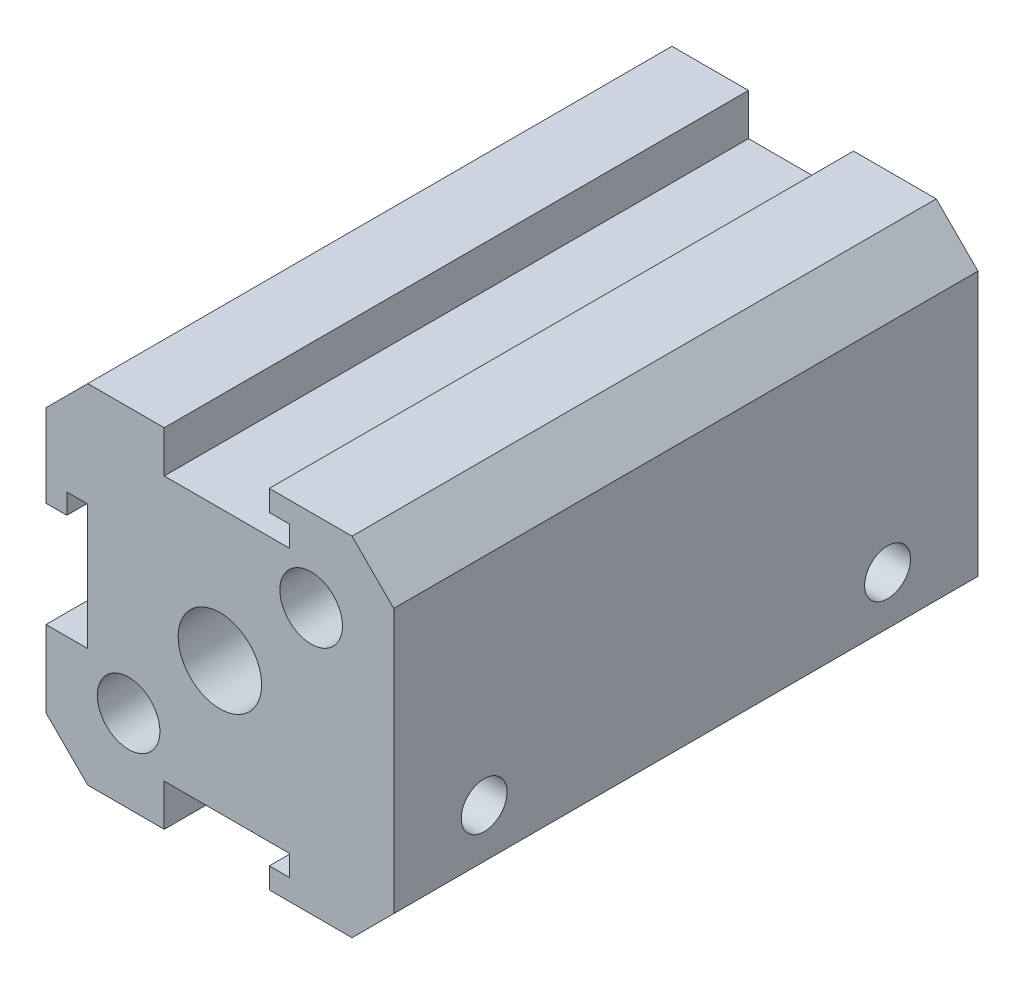
ISO-10303-21;
HEADER;
FILE_DESCRIPTION(('STEP AP214'),'2;1');
FILE_NAME('part.step','',(''),(''),'','','');
FILE_SCHEMA(('AUTOMOTIVE_DESIGN { 1 0 10303 214 1 1 1 1 }'));
ENDSEC;
DATA;
#1=APPLICATION_CONTEXT('core data for automotive mechanical design processes');
#2=APPLICATION_PROTOCOL_DEFINITION('international standard','automotive_design',2000,#1);
#3=PRODUCT_CONTEXT('',#1,'mechanical');
#4=PRODUCT('Part','Part','',(#3));
#5=PRODUCT_RELATED_PRODUCT_CATEGORY('part','',(#4));
#6=PRODUCT_DEFINITION_FORMATION('','',#4);
#7=PRODUCT_DEFINITION_CONTEXT('part definition',#1,'design');
#8=PRODUCT_DEFINITION('design','',#6,#7);
#9=PRODUCT_DEFINITION_SHAPE('','',#8);
#10=(LENGTH_UNIT() NAMED_UNIT(*) SI_UNIT(.MILLI.,.METRE.));
#11=(NAMED_UNIT(*) PLANE_ANGLE_UNIT() SI_UNIT($,.RADIAN.));
#12=(NAMED_UNIT(*) SI_UNIT($,.STERADIAN.) SOLID_ANGLE_UNIT());
#13=UNCERTAINTY_MEASURE_WITH_UNIT(LENGTH_MEASURE(1.E-05),#10,'distance_accuracy_value','');
#14=(GEOMETRIC_REPRESENTATION_CONTEXT(3) GLOBAL_UNCERTAINTY_ASSIGNED_CONTEXT((#13)) GLOBAL_UNIT_ASSIGNED_CONTEXT((#10,
#11,#12)) REPRESENTATION_CONTEXT('',''));
#15=CARTESIAN_POINT('',(0.,0.,0.));
#16=DIRECTION('',(0.,0.,1.));
#17=DIRECTION('',(1.,0.,0.));
#18=AXIS2_PLACEMENT_3D('',#15,#16,#17);
#19=CARTESIAN_POINT('',(0.,0.,42.));
#20=DIRECTION('',(0.,0.,-1.));
#21=DIRECTION('',(-1.,0.,0.));
#22=AXIS2_PLACEMENT_3D('',#19,#20,#21);
#23=PLANE('',#22);
#24=CARTESIAN_POINT('',(6.56066017177982,6.56066017177982,42.));
#25=DIRECTION('',(0.,0.,1.));
#26=DIRECTION('',(1.,0.,0.));
#27=AXIS2_PLACEMENT_3D('',#24,#25,#26);
#28=CIRCLE('',#27,2.24999999999999);
#29=CARTESIAN_POINT('',(8.81066017177981,6.56066017177982,42.));
#30=VERTEX_POINT('',#29);
#31=EDGE_CURVE('E493',#30,#30,#28,.T.);
#32=ORIENTED_EDGE('',*,*,#31,.F.);
#33=EDGE_LOOP('',(#32));
#34=FACE_BOUND('',#33,.T.);
#35=CARTESIAN_POINT('',(-6.56066017177982,-6.56066017177982,42.));
#36=DIRECTION('',(0.,0.,1.));
#37=DIRECTION('',(1.,0.,0.));
#38=AXIS2_PLACEMENT_3D('',#35,#36,#37);
#39=CIRCLE('',#38,2.24999999999999);
#40=CARTESIAN_POINT('',(-4.31066017177983,-6.56066017177982,42.));
#41=VERTEX_POINT('',#40);
#42=EDGE_CURVE('E499',#41,#41,#39,.T.);
#43=ORIENTED_EDGE('',*,*,#42,.F.);
#44=EDGE_LOOP('',(#43));
#45=FACE_BOUND('',#44,.T.);
#46=DIRECTION('',(0.,-1.,0.));
#47=VECTOR('',#46,1.);
#48=CARTESIAN_POINT('',(-12.5,-9.5,42.));
#49=LINE('',#48,#47);
#50=CARTESIAN_POINT('',(-12.5,-3.99999999999999,42.));
#51=VERTEX_POINT('',#50);
#52=CARTESIAN_POINT('',(-12.5,-9.5,42.));
#53=VERTEX_POINT('',#52);
#54=EDGE_CURVE('E291',#51,#53,#49,.T.);
#55=ORIENTED_EDGE('',*,*,#54,.T.);
#56=DIRECTION('',(0.707106781186547,-0.707106781186548,0.));
#57=VECTOR('',#56,1.);
#58=CARTESIAN_POINT('',(-12.5,-9.5,42.));
#59=LINE('',#58,#57);
#60=CARTESIAN_POINT('',(-9.5,-12.5,42.));
#61=VERTEX_POINT('',#60);
#62=EDGE_CURVE('E147',#53,#61,#59,.T.);
#63=ORIENTED_EDGE('',*,*,#62,.T.);
#64=DIRECTION('',(1.,0.,0.));
#65=VECTOR('',#64,1.);
#66=CARTESIAN_POINT('',(-9.5,-12.5,42.));
#67=LINE('',#66,#65);
#68=CARTESIAN_POINT('',(-4.,-12.5,42.));
#69=VERTEX_POINT('',#68);
#70=EDGE_CURVE('E360',#61,#69,#67,.T.);
#71=ORIENTED_EDGE('',*,*,#70,.T.);
#72=DIRECTION('',(0.,1.,0.));
#73=VECTOR('',#72,1.);
#74=CARTESIAN_POINT('',(-4.,-12.5,42.));
#75=LINE('',#74,#73);
#76=CARTESIAN_POINT('',(-3.99999999999999,-9.50000000000001,42.));
#77=VERTEX_POINT('',#76);
#78=EDGE_CURVE('E379',#69,#77,#75,.T.);
#79=ORIENTED_EDGE('',*,*,#78,.T.);
#80=DIRECTION('',(1.,0.,0.));
#81=VECTOR('',#80,1.);
#82=CARTESIAN_POINT('',(-3.99999999999999,-9.50000000000001,42.));
#83=LINE('',#82,#81);
#84=CARTESIAN_POINT('',(5.,-9.50000000000001,42.));
#85=VERTEX_POINT('',#84);
#86=EDGE_CURVE('E376',#77,#85,#83,.T.);
#87=ORIENTED_EDGE('',*,*,#86,.T.);
#88=DIRECTION('',(0.,-1.,0.));
#89=VECTOR('',#88,1.);
#90=CARTESIAN_POINT('',(5.,-9.50000000000001,42.));
#91=LINE('',#90,#89);
#92=CARTESIAN_POINT('',(5.,-11.,42.));
#93=VERTEX_POINT('',#92);
#94=EDGE_CURVE('E378',#85,#93,#91,.T.);
#95=ORIENTED_EDGE('',*,*,#94,.T.);
#96=DIRECTION('',(-1.,0.,0.));
#97=VECTOR('',#96,1.);
#98=CARTESIAN_POINT('',(5.,-11.,42.));
#99=LINE('',#98,#97);
#100=CARTESIAN_POINT('',(3.55,-11.,42.));
#101=VERTEX_POINT('',#100);
#102=EDGE_CURVE('E381',#93,#101,#99,.T.);
#103=ORIENTED_EDGE('',*,*,#102,.T.);
#104=DIRECTION('',(0.,-1.,0.));
#105=VECTOR('',#104,1.);
#106=CARTESIAN_POINT('',(3.55,-11.,42.));
#107=LINE('',#106,#105);
#108=CARTESIAN_POINT('',(3.55,-12.5,42.));
#109=VERTEX_POINT('',#108);
#110=EDGE_CURVE('E387',#101,#109,#107,.T.);
#111=ORIENTED_EDGE('',*,*,#110,.T.);
#112=DIRECTION('',(1.,0.,0.));
#113=VECTOR('',#112,1.);
#114=CARTESIAN_POINT('',(3.55,-12.5,42.));
#115=LINE('',#114,#113);
#116=CARTESIAN_POINT('',(9.5,-12.5,42.));
#117=VERTEX_POINT('',#116);
#118=EDGE_CURVE('E389',#109,#117,#115,.T.);
#119=ORIENTED_EDGE('',*,*,#118,.T.);
#120=DIRECTION('',(0.707106781186548,0.707106781186547,0.));
#121=VECTOR('',#120,1.);
#122=CARTESIAN_POINT('',(9.5,-12.5,42.));
#123=LINE('',#122,#121);
#124=CARTESIAN_POINT('',(12.5,-9.50000000000001,42.));
#125=VERTEX_POINT('',#124);
#126=EDGE_CURVE('E391',#117,#125,#123,.T.);
#127=ORIENTED_EDGE('',*,*,#126,.T.);
#128=DIRECTION('',(0.,1.,0.));
#129=VECTOR('',#128,1.);
#130=CARTESIAN_POINT('',(12.5,-9.50000000000001,42.));
#131=LINE('',#130,#129);
#132=CARTESIAN_POINT('',(12.5,9.5,42.));
#133=VERTEX_POINT('',#132);
#134=EDGE_CURVE('E393',#125,#133,#131,.T.);
#135=ORIENTED_EDGE('',*,*,#134,.T.);
#136=DIRECTION('',(-0.707106781186548,0.707106781186548,0.));
#137=VECTOR('',#136,1.);
#138=CARTESIAN_POINT('',(12.5,9.5,42.));
#139=LINE('',#138,#137);
#140=CARTESIAN_POINT('',(9.5,12.5,42.));
#141=VERTEX_POINT('',#140);
#142=EDGE_CURVE('E395',#133,#141,#139,.T.);
#143=ORIENTED_EDGE('',*,*,#142,.T.);
#144=DIRECTION('',(-1.,0.,0.));
#145=VECTOR('',#144,1.);
#146=CARTESIAN_POINT('',(3.55,12.5,42.));
#147=LINE('',#146,#145);
#148=CARTESIAN_POINT('',(3.55,12.5,42.));
#149=VERTEX_POINT('',#148);
#150=EDGE_CURVE('E397',#141,#149,#147,.T.);
#151=ORIENTED_EDGE('',*,*,#150,.T.);
#152=DIRECTION('',(0.,-1.,0.));
#153=VECTOR('',#152,1.);
#154=CARTESIAN_POINT('',(3.55,11.,42.));
#155=LINE('',#154,#153);
#156=CARTESIAN_POINT('',(3.55,11.,42.));
#157=VERTEX_POINT('',#156);
#158=EDGE_CURVE('E399',#149,#157,#155,.T.);
#159=ORIENTED_EDGE('',*,*,#158,.T.);
#160=DIRECTION('',(1.,0.,0.));
#161=VECTOR('',#160,1.);
#162=CARTESIAN_POINT('',(5.,11.,42.));
#163=LINE('',#162,#161);
#164=CARTESIAN_POINT('',(5.,11.,42.));
#165=VERTEX_POINT('',#164);
#166=EDGE_CURVE('E401',#157,#165,#163,.T.);
#167=ORIENTED_EDGE('',*,*,#166,.T.);
#168=DIRECTION('',(0.,-1.,0.));
#169=VECTOR('',#168,1.);
#170=CARTESIAN_POINT('',(5.,9.5,42.));
#171=LINE('',#170,#169);
#172=CARTESIAN_POINT('',(5.,9.5,42.));
#173=VERTEX_POINT('',#172);
#174=EDGE_CURVE('E403',#165,#173,#171,.T.);
#175=ORIENTED_EDGE('',*,*,#174,.T.);
#176=DIRECTION('',(-1.,0.,0.));
#177=VECTOR('',#176,1.);
#178=CARTESIAN_POINT('',(-4.,9.5,42.));
#179=LINE('',#178,#177);
#180=CARTESIAN_POINT('',(-4.,9.5,42.));
#181=VERTEX_POINT('',#180);
#182=EDGE_CURVE('E405',#173,#181,#179,.T.);
#183=ORIENTED_EDGE('',*,*,#182,.T.);
#184=DIRECTION('',(0.,1.,0.));
#185=VECTOR('',#184,1.);
#186=CARTESIAN_POINT('',(-4.,12.5,42.));
#187=LINE('',#186,#185);
#188=CARTESIAN_POINT('',(-4.,12.5,42.));
#189=VERTEX_POINT('',#188);
#190=EDGE_CURVE('E407',#181,#189,#187,.T.);
#191=ORIENTED_EDGE('',*,*,#190,.T.);
#192=DIRECTION('',(-1.,0.,0.));
#193=VECTOR('',#192,1.);
#194=CARTESIAN_POINT('',(-9.5,12.5,42.));
#195=LINE('',#194,#193);
#196=CARTESIAN_POINT('',(-9.5,12.5,42.));
#197=VERTEX_POINT('',#196);
#198=EDGE_CURVE('E409',#189,#197,#195,.T.);
#199=ORIENTED_EDGE('',*,*,#198,.T.);
#200=DIRECTION('',(-0.707106781186548,-0.707106781186548,0.));
#201=VECTOR('',#200,1.);
#202=CARTESIAN_POINT('',(-9.5,12.5,42.));
#203=LINE('',#202,#201);
#204=CARTESIAN_POINT('',(-12.5,9.5,42.));
#205=VERTEX_POINT('',#204);
#206=EDGE_CURVE('E411',#197,#205,#203,.T.);
#207=ORIENTED_EDGE('',*,*,#206,.T.);
#208=DIRECTION('',(0.,-1.,0.));
#209=VECTOR('',#208,1.);
#210=CARTESIAN_POINT('',(-12.5,3.55,42.));
#211=LINE('',#210,#209);
#212=CARTESIAN_POINT('',(-12.5,3.55,42.));
#213=VERTEX_POINT('',#212);
#214=EDGE_CURVE('E413',#205,#213,#211,.T.);
#215=ORIENTED_EDGE('',*,*,#214,.T.);
#216=DIRECTION('',(1.,0.,0.));
#217=VECTOR('',#216,1.);
#218=CARTESIAN_POINT('',(-11.,3.55,42.));
#219=LINE('',#218,#217);
#220=CARTESIAN_POINT('',(-11.,3.55,42.));
#221=VERTEX_POINT('',#220);
#222=EDGE_CURVE('E415',#213,#221,#219,.T.);
#223=ORIENTED_EDGE('',*,*,#222,.T.);
#224=DIRECTION('',(0.,1.,0.));
#225=VECTOR('',#224,1.);
#226=CARTESIAN_POINT('',(-11.,5.,42.));
#227=LINE('',#226,#225);
#228=CARTESIAN_POINT('',(-11.,5.,42.));
#229=VERTEX_POINT('',#228);
#230=EDGE_CURVE('E222',#221,#229,#227,.T.);
#231=ORIENTED_EDGE('',*,*,#230,.T.);
#232=DIRECTION('',(1.,0.,0.));
#233=VECTOR('',#232,1.);
#234=CARTESIAN_POINT('',(-9.5,5.,42.));
#235=LINE('',#234,#233);
#236=CARTESIAN_POINT('',(-9.5,5.,42.));
#237=VERTEX_POINT('',#236);
#238=EDGE_CURVE('E216',#229,#237,#235,.T.);
#239=ORIENTED_EDGE('',*,*,#238,.T.);
#240=DIRECTION('',(0.,-1.,0.));
#241=VECTOR('',#240,1.);
#242=CARTESIAN_POINT('',(-9.5,-3.99999999999999,42.));
#243=LINE('',#242,#241);
#244=CARTESIAN_POINT('',(-9.5,-3.99999999999999,42.));
#245=VERTEX_POINT('',#244);
#246=EDGE_CURVE('E220',#237,#245,#243,.T.);
#247=ORIENTED_EDGE('',*,*,#246,.T.);
#248=DIRECTION('',(-1.,0.,0.));
#249=VECTOR('',#248,1.);
#250=CARTESIAN_POINT('',(-12.5,-3.99999999999999,42.));
#251=LINE('',#250,#249);
#252=EDGE_CURVE('E49',#245,#51,#251,.T.);
#253=ORIENTED_EDGE('',*,*,#252,.T.);
#254=EDGE_LOOP('',(#55,#63,#71,#79,#87,#95,#103,#111,#119,#127,#135,#143,#151,#159,#167,#175,
#183,#191,#199,#207,#215,#223,#231,#239,#247,#253));
#255=FACE_BOUND('',#254,.T.);
#256=CARTESIAN_POINT('',(0.,0.,42.));
#257=DIRECTION('',(0.,0.,1.));
#258=DIRECTION('',(1.,0.,0.));
#259=AXIS2_PLACEMENT_3D('',#256,#257,#258);
#260=CIRCLE('',#259,3.);
#261=CARTESIAN_POINT('',(-3.,0.,42.));
#262=VERTEX_POINT('',#261);
#263=EDGE_CURVE('E244',#262,#262,#260,.T.);
#264=ORIENTED_EDGE('',*,*,#263,.F.);
#265=EDGE_LOOP('',(#264));
#266=FACE_BOUND('',#265,.T.);
#267=ADVANCED_FACE('F32',(#34,#45,#255,#266),#23,.F.);
#268=CARTESIAN_POINT('',(0.,0.,0.));
#269=DIRECTION('',(0.,0.,-1.));
#270=DIRECTION('',(-1.,0.,0.));
#271=AXIS2_PLACEMENT_3D('',#268,#269,#270);
#272=PLANE('',#271);
#273=CARTESIAN_POINT('',(6.56066017177982,6.56066017177982,0.));
#274=DIRECTION('',(0.,0.,1.));
#275=DIRECTION('',(1.,0.,0.));
#276=AXIS2_PLACEMENT_3D('',#273,#274,#275);
#277=CIRCLE('',#276,2.25);
#278=CARTESIAN_POINT('',(8.81066017177982,6.56066017177982,0.));
#279=VERTEX_POINT('',#278);
#280=EDGE_CURVE('E496',#279,#279,#277,.T.);
#281=ORIENTED_EDGE('',*,*,#280,.T.);
#282=EDGE_LOOP('',(#281));
#283=FACE_BOUND('',#282,.T.);
#284=CARTESIAN_POINT('',(-6.56066017177982,-6.56066017177982,0.));
#285=DIRECTION('',(0.,0.,1.));
#286=DIRECTION('',(1.,0.,0.));
#287=AXIS2_PLACEMENT_3D('',#284,#285,#286);
#288=CIRCLE('',#287,2.25);
#289=CARTESIAN_POINT('',(-4.31066017177983,-6.56066017177982,0.));
#290=VERTEX_POINT('',#289);
#291=EDGE_CURVE('E502',#290,#290,#288,.T.);
#292=ORIENTED_EDGE('',*,*,#291,.T.);
#293=EDGE_LOOP('',(#292));
#294=FACE_BOUND('',#293,.T.);
#295=DIRECTION('',(0.,-1.,0.));
#296=VECTOR('',#295,1.);
#297=CARTESIAN_POINT('',(-12.5,-9.5,0.));
#298=LINE('',#297,#296);
#299=CARTESIAN_POINT('',(-12.5,-3.99999999999999,0.));
#300=VERTEX_POINT('',#299);
#301=CARTESIAN_POINT('',(-12.5,-9.5,0.));
#302=VERTEX_POINT('',#301);
#303=EDGE_CURVE('E240',#300,#302,#298,.T.);
#304=ORIENTED_EDGE('',*,*,#303,.F.);
#305=DIRECTION('',(-1.,0.,0.));
#306=VECTOR('',#305,1.);
#307=CARTESIAN_POINT('',(-12.5,-3.99999999999999,0.));
#308=LINE('',#307,#306);
#309=CARTESIAN_POINT('',(-9.5,-3.99999999999999,0.));
#310=VERTEX_POINT('',#309);
#311=EDGE_CURVE('E139',#310,#300,#308,.T.);
#312=ORIENTED_EDGE('',*,*,#311,.F.);
#313=DIRECTION('',(0.,-1.,0.));
#314=VECTOR('',#313,1.);
#315=CARTESIAN_POINT('',(-9.5,-3.99999999999999,0.));
#316=LINE('',#315,#314);
#317=CARTESIAN_POINT('',(-9.5,5.,0.));
#318=VERTEX_POINT('',#317);
#319=EDGE_CURVE('E133',#318,#310,#316,.T.);
#320=ORIENTED_EDGE('',*,*,#319,.F.);
#321=DIRECTION('',(1.,0.,0.));
#322=VECTOR('',#321,1.);
#323=CARTESIAN_POINT('',(-9.5,5.,0.));
#324=LINE('',#323,#322);
#325=CARTESIAN_POINT('',(-11.,5.,0.));
#326=VERTEX_POINT('',#325);
#327=EDGE_CURVE('E230',#326,#318,#324,.T.);
#328=ORIENTED_EDGE('',*,*,#327,.F.);
#329=DIRECTION('',(0.,1.,0.));
#330=VECTOR('',#329,1.);
#331=CARTESIAN_POINT('',(-11.,5.,0.));
#332=LINE('',#331,#330);
#333=CARTESIAN_POINT('',(-11.,3.55,0.));
#334=VERTEX_POINT('',#333);
#335=EDGE_CURVE('E286',#334,#326,#332,.T.);
#336=ORIENTED_EDGE('',*,*,#335,.F.);
#337=DIRECTION('',(1.,0.,0.));
#338=VECTOR('',#337,1.);
#339=CARTESIAN_POINT('',(-11.,3.55,0.));
#340=LINE('',#339,#338);
#341=CARTESIAN_POINT('',(-12.5,3.55,0.));
#342=VERTEX_POINT('',#341);
#343=EDGE_CURVE('E284',#342,#334,#340,.T.);
#344=ORIENTED_EDGE('',*,*,#343,.F.);
#345=DIRECTION('',(0.,-1.,0.));
#346=VECTOR('',#345,1.);
#347=CARTESIAN_POINT('',(-12.5,3.55,0.));
#348=LINE('',#347,#346);
#349=CARTESIAN_POINT('',(-12.5,9.5,0.));
#350=VERTEX_POINT('',#349);
#351=EDGE_CURVE('E282',#350,#342,#348,.T.);
#352=ORIENTED_EDGE('',*,*,#351,.F.);
#353=DIRECTION('',(-0.707106781186548,-0.707106781186548,0.));
#354=VECTOR('',#353,1.);
#355=CARTESIAN_POINT('',(-9.5,12.5,0.));
#356=LINE('',#355,#354);
#357=CARTESIAN_POINT('',(-9.5,12.5,0.));
#358=VERTEX_POINT('',#357);
#359=EDGE_CURVE('E280',#358,#350,#356,.T.);
#360=ORIENTED_EDGE('',*,*,#359,.F.);
#361=DIRECTION('',(-1.,0.,0.));
#362=VECTOR('',#361,1.);
#363=CARTESIAN_POINT('',(-9.5,12.5,0.));
#364=LINE('',#363,#362);
#365=CARTESIAN_POINT('',(-4.,12.5,0.));
#366=VERTEX_POINT('',#365);
#367=EDGE_CURVE('E278',#366,#358,#364,.T.);
#368=ORIENTED_EDGE('',*,*,#367,.F.);
#369=DIRECTION('',(0.,1.,0.));
#370=VECTOR('',#369,1.);
#371=CARTESIAN_POINT('',(-4.,12.5,0.));
#372=LINE('',#371,#370);
#373=CARTESIAN_POINT('',(-4.,9.5,0.));
#374=VERTEX_POINT('',#373);
#375=EDGE_CURVE('E276',#374,#366,#372,.T.);
#376=ORIENTED_EDGE('',*,*,#375,.F.);
#377=DIRECTION('',(-1.,0.,0.));
#378=VECTOR('',#377,1.);
#379=CARTESIAN_POINT('',(-4.,9.5,0.));
#380=LINE('',#379,#378);
#381=CARTESIAN_POINT('',(5.,9.5,0.));
#382=VERTEX_POINT('',#381);
#383=EDGE_CURVE('E274',#382,#374,#380,.T.);
#384=ORIENTED_EDGE('',*,*,#383,.F.);
#385=DIRECTION('',(0.,-1.,0.));
#386=VECTOR('',#385,1.);
#387=CARTESIAN_POINT('',(5.,9.5,0.));
#388=LINE('',#387,#386);
#389=CARTESIAN_POINT('',(5.,11.,0.));
#390=VERTEX_POINT('',#389);
#391=EDGE_CURVE('E272',#390,#382,#388,.T.);
#392=ORIENTED_EDGE('',*,*,#391,.F.);
#393=DIRECTION('',(1.,0.,0.));
#394=VECTOR('',#393,1.);
#395=CARTESIAN_POINT('',(5.,11.,0.));
#396=LINE('',#395,#394);
#397=CARTESIAN_POINT('',(3.55,11.,0.));
#398=VERTEX_POINT('',#397);
#399=EDGE_CURVE('E270',#398,#390,#396,.T.);
#400=ORIENTED_EDGE('',*,*,#399,.F.);
#401=DIRECTION('',(0.,-1.,0.));
#402=VECTOR('',#401,1.);
#403=CARTESIAN_POINT('',(3.55,11.,0.));
#404=LINE('',#403,#402);
#405=CARTESIAN_POINT('',(3.55,12.5,0.));
#406=VERTEX_POINT('',#405);
#407=EDGE_CURVE('E268',#406,#398,#404,.T.);
#408=ORIENTED_EDGE('',*,*,#407,.F.);
#409=DIRECTION('',(-1.,0.,0.));
#410=VECTOR('',#409,1.);
#411=CARTESIAN_POINT('',(3.55,12.5,0.));
#412=LINE('',#411,#410);
#413=CARTESIAN_POINT('',(9.5,12.5,0.));
#414=VERTEX_POINT('',#413);
#415=EDGE_CURVE('E266',#414,#406,#412,.T.);
#416=ORIENTED_EDGE('',*,*,#415,.F.);
#417=DIRECTION('',(-0.707106781186548,0.707106781186548,0.));
#418=VECTOR('',#417,1.);
#419=CARTESIAN_POINT('',(12.5,9.5,0.));
#420=LINE('',#419,#418);
#421=CARTESIAN_POINT('',(12.5,9.5,0.));
#422=VERTEX_POINT('',#421);
#423=EDGE_CURVE('E264',#422,#414,#420,.T.);
#424=ORIENTED_EDGE('',*,*,#423,.F.);
#425=DIRECTION('',(0.,1.,0.));
#426=VECTOR('',#425,1.);
#427=CARTESIAN_POINT('',(12.5,-9.50000000000001,0.));
#428=LINE('',#427,#426);
#429=CARTESIAN_POINT('',(12.5,-9.50000000000001,0.));
#430=VERTEX_POINT('',#429);
#431=EDGE_CURVE('E262',#430,#422,#428,.T.);
#432=ORIENTED_EDGE('',*,*,#431,.F.);
#433=DIRECTION('',(0.707106781186548,0.707106781186547,0.));
#434=VECTOR('',#433,1.);
#435=CARTESIAN_POINT('',(9.5,-12.5,0.));
#436=LINE('',#435,#434);
#437=CARTESIAN_POINT('',(9.5,-12.5,0.));
#438=VERTEX_POINT('',#437);
#439=EDGE_CURVE('E260',#438,#430,#436,.T.);
#440=ORIENTED_EDGE('',*,*,#439,.F.);
#441=DIRECTION('',(1.,0.,0.));
#442=VECTOR('',#441,1.);
#443=CARTESIAN_POINT('',(3.55,-12.5,0.));
#444=LINE('',#443,#442);
#445=CARTESIAN_POINT('',(3.55,-12.5,0.));
#446=VERTEX_POINT('',#445);
#447=EDGE_CURVE('E258',#446,#438,#444,.T.);
#448=ORIENTED_EDGE('',*,*,#447,.F.);
#449=DIRECTION('',(0.,-1.,0.));
#450=VECTOR('',#449,1.);
#451=CARTESIAN_POINT('',(3.55,-11.,0.));
#452=LINE('',#451,#450);
#453=CARTESIAN_POINT('',(3.55,-11.,0.));
#454=VERTEX_POINT('',#453);
#455=EDGE_CURVE('E256',#454,#446,#452,.T.);
#456=ORIENTED_EDGE('',*,*,#455,.F.);
#457=DIRECTION('',(-1.,0.,0.));
#458=VECTOR('',#457,1.);
#459=CARTESIAN_POINT('',(5.,-11.,0.));
#460=LINE('',#459,#458);
#461=CARTESIAN_POINT('',(5.,-11.,0.));
#462=VERTEX_POINT('',#461);
#463=EDGE_CURVE('E254',#462,#454,#460,.T.);
#464=ORIENTED_EDGE('',*,*,#463,.F.);
#465=DIRECTION('',(0.,-1.,0.));
#466=VECTOR('',#465,1.);
#467=CARTESIAN_POINT('',(5.,-9.50000000000001,0.));
#468=LINE('',#467,#466);
#469=CARTESIAN_POINT('',(5.,-9.50000000000001,0.));
#470=VERTEX_POINT('',#469);
#471=EDGE_CURVE('E252',#470,#462,#468,.T.);
#472=ORIENTED_EDGE('',*,*,#471,.F.);
#473=DIRECTION('',(1.,0.,0.));
#474=VECTOR('',#473,1.);
#475=CARTESIAN_POINT('',(-3.99999999999999,-9.50000000000001,0.));
#476=LINE('',#475,#474);
#477=CARTESIAN_POINT('',(-3.99999999999999,-9.50000000000001,0.));
#478=VERTEX_POINT('',#477);
#479=EDGE_CURVE('E250',#478,#470,#476,.T.);
#480=ORIENTED_EDGE('',*,*,#479,.F.);
#481=DIRECTION('',(0.,1.,0.));
#482=VECTOR('',#481,1.);
#483=CARTESIAN_POINT('',(-4.,-12.5,0.));
#484=LINE('',#483,#482);
#485=CARTESIAN_POINT('',(-4.,-12.5,0.));
#486=VERTEX_POINT('',#485);
#487=EDGE_CURVE('E248',#486,#478,#484,.T.);
#488=ORIENTED_EDGE('',*,*,#487,.F.);
#489=DIRECTION('',(1.,0.,0.));
#490=VECTOR('',#489,1.);
#491=CARTESIAN_POINT('',(-9.5,-12.5,0.));
#492=LINE('',#491,#490);
#493=CARTESIAN_POINT('',(-9.5,-12.5,0.));
#494=VERTEX_POINT('',#493);
#495=EDGE_CURVE('E246',#494,#486,#492,.T.);
#496=ORIENTED_EDGE('',*,*,#495,.F.);
#497=DIRECTION('',(0.707106781186547,-0.707106781186548,0.));
#498=VECTOR('',#497,1.);
#499=CARTESIAN_POINT('',(-12.5,-9.5,0.));
#500=LINE('',#499,#498);
#501=EDGE_CURVE('E243',#302,#494,#500,.T.);
#502=ORIENTED_EDGE('',*,*,#501,.F.);
#503=EDGE_LOOP('',(#304,#312,#320,#328,#336,#344,#352,#360,#368,#376,#384,#392,#400,#408,#416,
#424,#432,#440,#448,#456,#464,#472,#480,#488,#496,#502));
#504=FACE_BOUND('',#503,.T.);
#505=CARTESIAN_POINT('',(0.,0.,0.));
#506=DIRECTION('',(0.,0.,1.));
#507=DIRECTION('',(1.,0.,0.));
#508=AXIS2_PLACEMENT_3D('',#505,#506,#507);
#509=CIRCLE('',#508,3.);
#510=CARTESIAN_POINT('',(-3.,0.,0.));
#511=VERTEX_POINT('',#510);
#512=EDGE_CURVE('E505',#511,#511,#509,.T.);
#513=ORIENTED_EDGE('',*,*,#512,.T.);
#514=EDGE_LOOP('',(#513));
#515=FACE_BOUND('',#514,.T.);
#516=ADVANCED_FACE('F364',(#283,#294,#504,#515),#272,.T.);
#517=CARTESIAN_POINT('',(-12.5,-9.5,42.));
#518=DIRECTION('',(1.,0.,0.));
#519=DIRECTION('',(0.,1.,0.));
#520=AXIS2_PLACEMENT_3D('',#517,#518,#519);
#521=PLANE('',#520);
#522=ORIENTED_EDGE('',*,*,#303,.T.);
#523=DIRECTION('',(0.,0.,-1.));
#524=VECTOR('',#523,1.);
#525=CARTESIAN_POINT('',(-12.5,-9.5,42.));
#526=LINE('',#525,#524);
#527=EDGE_CURVE('E11',#53,#302,#526,.T.);
#528=ORIENTED_EDGE('',*,*,#527,.F.);
#529=ORIENTED_EDGE('',*,*,#54,.F.);
#530=DIRECTION('',(0.,0.,-1.));
#531=VECTOR('',#530,1.);
#532=CARTESIAN_POINT('',(-12.5,-3.99999999999999,42.));
#533=LINE('',#532,#531);
#534=EDGE_CURVE('E236',#51,#300,#533,.T.);
#535=ORIENTED_EDGE('',*,*,#534,.T.);
#536=EDGE_LOOP('',(#522,#528,#529,#535));
#537=FACE_BOUND('',#536,.T.);
#538=ADVANCED_FACE('F34',(#537),#521,.F.);
#539=CARTESIAN_POINT('',(-12.5,-9.5,42.));
#540=DIRECTION('',(0.707106781186548,0.707106781186547,0.));
#541=DIRECTION('',(-0.707106781186547,0.707106781186548,0.));
#542=AXIS2_PLACEMENT_3D('',#539,#540,#541);
#543=PLANE('',#542);
#544=ORIENTED_EDGE('',*,*,#501,.T.);
#545=DIRECTION('',(0.,0.,-1.));
#546=VECTOR('',#545,1.);
#547=CARTESIAN_POINT('',(-9.5,-12.5,42.));
#548=LINE('',#547,#546);
#549=EDGE_CURVE('E41',#61,#494,#548,.T.);
#550=ORIENTED_EDGE('',*,*,#549,.F.);
#551=ORIENTED_EDGE('',*,*,#62,.F.);
#552=ORIENTED_EDGE('',*,*,#527,.T.);
#553=EDGE_LOOP('',(#544,#550,#551,#552));
#554=FACE_BOUND('',#553,.T.);
#555=ADVANCED_FACE('F586',(#554),#543,.F.);
#556=CARTESIAN_POINT('',(-9.5,-12.5,42.));
#557=DIRECTION('',(0.,1.,0.));
#558=DIRECTION('',(-1.,0.,0.));
#559=AXIS2_PLACEMENT_3D('',#556,#557,#558);
#560=PLANE('',#559);
#561=ORIENTED_EDGE('',*,*,#495,.T.);
#562=DIRECTION('',(0.,0.,-1.));
#563=VECTOR('',#562,1.);
#564=CARTESIAN_POINT('',(-4.,-12.5,42.));
#565=LINE('',#564,#563);
#566=EDGE_CURVE('E352',#69,#486,#565,.T.);
#567=ORIENTED_EDGE('',*,*,#566,.F.);
#568=ORIENTED_EDGE('',*,*,#70,.F.);
#569=ORIENTED_EDGE('',*,*,#549,.T.);
#570=EDGE_LOOP('',(#561,#567,#568,#569));
#571=FACE_BOUND('',#570,.T.);
#572=ADVANCED_FACE('F358',(#571),#560,.F.);
#573=CARTESIAN_POINT('',(-4.,-12.5,42.));
#574=DIRECTION('',(-1.,0.,0.));
#575=DIRECTION('',(0.,-1.,0.));
#576=AXIS2_PLACEMENT_3D('',#573,#574,#575);
#577=PLANE('',#576);
#578=ORIENTED_EDGE('',*,*,#487,.T.);
#579=DIRECTION('',(0.,0.,-1.));
#580=VECTOR('',#579,1.);
#581=CARTESIAN_POINT('',(-3.99999999999999,-9.50000000000001,42.));
#582=LINE('',#581,#580);
#583=EDGE_CURVE('E349',#77,#478,#582,.T.);
#584=ORIENTED_EDGE('',*,*,#583,.F.);
#585=ORIENTED_EDGE('',*,*,#78,.F.);
#586=ORIENTED_EDGE('',*,*,#566,.T.);
#587=EDGE_LOOP('',(#578,#584,#585,#586));
#588=FACE_BOUND('',#587,.T.);
#589=ADVANCED_FACE('F370',(#588),#577,.F.);
#590=CARTESIAN_POINT('',(-3.99999999999999,-9.50000000000001,42.));
#591=DIRECTION('',(0.,1.,0.));
#592=DIRECTION('',(0.,0.,1.));
#593=AXIS2_PLACEMENT_3D('',#590,#591,#592);
#594=PLANE('',#593);
#595=ORIENTED_EDGE('',*,*,#479,.T.);
#596=DIRECTION('',(0.,0.,-1.));
#597=VECTOR('',#596,1.);
#598=CARTESIAN_POINT('',(5.,-9.50000000000001,42.));
#599=LINE('',#598,#597);
#600=EDGE_CURVE('E346',#85,#470,#599,.T.);
#601=ORIENTED_EDGE('',*,*,#600,.F.);
#602=ORIENTED_EDGE('',*,*,#86,.F.);
#603=ORIENTED_EDGE('',*,*,#583,.T.);
#604=EDGE_LOOP('',(#595,#601,#602,#603));
#605=FACE_BOUND('',#604,.T.);
#606=ADVANCED_FACE('F374',(#605),#594,.F.);
#607=CARTESIAN_POINT('',(5.,-9.50000000000001,42.));
#608=DIRECTION('',(1.,0.,0.));
#609=DIRECTION('',(0.,1.,0.));
#610=AXIS2_PLACEMENT_3D('',#607,#608,#609);
#611=PLANE('',#610);
#612=ORIENTED_EDGE('',*,*,#471,.T.);
#613=DIRECTION('',(0.,0.,-1.));
#614=VECTOR('',#613,1.);
#615=CARTESIAN_POINT('',(5.,-11.,42.));
#616=LINE('',#615,#614);
#617=EDGE_CURVE('E343',#93,#462,#616,.T.);
#618=ORIENTED_EDGE('',*,*,#617,.F.);
#619=ORIENTED_EDGE('',*,*,#94,.F.);
#620=ORIENTED_EDGE('',*,*,#600,.T.);
#621=EDGE_LOOP('',(#612,#618,#619,#620));
#622=FACE_BOUND('',#621,.T.);
#623=ADVANCED_FACE('F572',(#622),#611,.F.);
#624=CARTESIAN_POINT('',(5.,-11.,42.));
#625=DIRECTION('',(0.,-1.,0.));
#626=DIRECTION('',(1.,0.,0.));
#627=AXIS2_PLACEMENT_3D('',#624,#625,#626);
#628=PLANE('',#627);
#629=ORIENTED_EDGE('',*,*,#463,.T.);
#630=DIRECTION('',(0.,0.,-1.));
#631=VECTOR('',#630,1.);
#632=CARTESIAN_POINT('',(3.55,-11.,42.));
#633=LINE('',#632,#631);
#634=EDGE_CURVE('E340',#101,#454,#633,.T.);
#635=ORIENTED_EDGE('',*,*,#634,.F.);
#636=ORIENTED_EDGE('',*,*,#102,.F.);
#637=ORIENTED_EDGE('',*,*,#617,.T.);
#638=EDGE_LOOP('',(#629,#635,#636,#637));
#639=FACE_BOUND('',#638,.T.);
#640=ADVANCED_FACE('F569',(#639),#628,.F.);
#641=CARTESIAN_POINT('',(3.55,-11.,42.));
#642=DIRECTION('',(1.,0.,0.));
#643=DIRECTION('',(0.,1.,0.));
#644=AXIS2_PLACEMENT_3D('',#641,#642,#643);
#645=PLANE('',#644);
#646=ORIENTED_EDGE('',*,*,#455,.T.);
#647=DIRECTION('',(0.,0.,-1.));
#648=VECTOR('',#647,1.);
#649=CARTESIAN_POINT('',(3.55,-12.5,42.));
#650=LINE('',#649,#648);
#651=EDGE_CURVE('E337',#109,#446,#650,.T.);
#652=ORIENTED_EDGE('',*,*,#651,.F.);
#653=ORIENTED_EDGE('',*,*,#110,.F.);
#654=ORIENTED_EDGE('',*,*,#634,.T.);
#655=EDGE_LOOP('',(#646,#652,#653,#654));
#656=FACE_BOUND('',#655,.T.);
#657=ADVANCED_FACE('F565',(#656),#645,.F.);
#658=CARTESIAN_POINT('',(3.55,-12.5,42.));
#659=DIRECTION('',(0.,1.,0.));
#660=DIRECTION('',(-1.,0.,0.));
#661=AXIS2_PLACEMENT_3D('',#658,#659,#660);
#662=PLANE('',#661);
#663=ORIENTED_EDGE('',*,*,#447,.T.);
#664=DIRECTION('',(0.,0.,-1.));
#665=VECTOR('',#664,1.);
#666=CARTESIAN_POINT('',(9.5,-12.5,42.));
#667=LINE('',#666,#665);
#668=EDGE_CURVE('E334',#117,#438,#667,.T.);
#669=ORIENTED_EDGE('',*,*,#668,.F.);
#670=ORIENTED_EDGE('',*,*,#118,.F.);
#671=ORIENTED_EDGE('',*,*,#651,.T.);
#672=EDGE_LOOP('',(#663,#669,#670,#671));
#673=FACE_BOUND('',#672,.T.);
#674=ADVANCED_FACE('F561',(#673),#662,.F.);
#675=CARTESIAN_POINT('',(9.5,-12.5,42.));
#676=DIRECTION('',(-0.707106781186547,0.707106781186548,0.));
#677=DIRECTION('',(-0.707106781186548,-0.707106781186547,0.));
#678=AXIS2_PLACEMENT_3D('',#675,#676,#677);
#679=PLANE('',#678);
#680=ORIENTED_EDGE('',*,*,#439,.T.);
#681=DIRECTION('',(0.,0.,-1.));
#682=VECTOR('',#681,1.);
#683=CARTESIAN_POINT('',(12.5,-9.50000000000001,42.));
#684=LINE('',#683,#682);
#685=EDGE_CURVE('E331',#125,#430,#684,.T.);
#686=ORIENTED_EDGE('',*,*,#685,.F.);
#687=ORIENTED_EDGE('',*,*,#126,.F.);
#688=ORIENTED_EDGE('',*,*,#668,.T.);
#689=EDGE_LOOP('',(#680,#686,#687,#688));
#690=FACE_BOUND('',#689,.T.);
#691=ADVANCED_FACE('F529',(#690),#679,.F.);
#692=CARTESIAN_POINT('',(12.5,-9.50000000000001,42.));
#693=DIRECTION('',(-1.,0.,0.));
#694=DIRECTION('',(0.,0.,1.));
#695=AXIS2_PLACEMENT_3D('',#692,#693,#694);
#696=PLANE('',#695);
#697=CARTESIAN_POINT('',(12.5,-6.,35.5));
#698=DIRECTION('',(1.,0.,0.));
#699=DIRECTION('',(0.,0.,-1.));
#700=AXIS2_PLACEMENT_3D('',#697,#698,#699);
#701=CIRCLE('',#700,1.65);
#702=CARTESIAN_POINT('',(12.5,-6.,33.85));
#703=VERTEX_POINT('',#702);
#704=EDGE_CURVE('E482',#703,#703,#701,.T.);
#705=ORIENTED_EDGE('',*,*,#704,.F.);
#706=EDGE_LOOP('',(#705));
#707=FACE_BOUND('',#706,.T.);
#708=CARTESIAN_POINT('',(12.5,-6.,6.5));
#709=DIRECTION('',(1.,0.,0.));
#710=DIRECTION('',(0.,0.,-1.));
#711=AXIS2_PLACEMENT_3D('',#708,#709,#710);
#712=CIRCLE('',#711,1.65);
#713=CARTESIAN_POINT('',(12.5,-6.,4.85));
#714=VERTEX_POINT('',#713);
#715=EDGE_CURVE('E485',#714,#714,#712,.T.);
#716=ORIENTED_EDGE('',*,*,#715,.F.);
#717=EDGE_LOOP('',(#716));
#718=FACE_BOUND('',#717,.T.);
#719=ORIENTED_EDGE('',*,*,#431,.T.);
#720=DIRECTION('',(0.,0.,-1.));
#721=VECTOR('',#720,1.);
#722=CARTESIAN_POINT('',(12.5,9.5,42.));
#723=LINE('',#722,#721);
#724=EDGE_CURVE('E328',#133,#422,#723,.T.);
#725=ORIENTED_EDGE('',*,*,#724,.F.);
#726=ORIENTED_EDGE('',*,*,#134,.F.);
#727=ORIENTED_EDGE('',*,*,#685,.T.);
#728=EDGE_LOOP('',(#719,#725,#726,#727));
#729=FACE_BOUND('',#728,.T.);
#730=ADVANCED_FACE('F525',(#707,#718,#729),#696,.F.);
#731=CARTESIAN_POINT('',(12.5,9.5,42.));
#732=DIRECTION('',(-0.707106781186547,-0.707106781186547,0.));
#733=DIRECTION('',(0.707106781186548,-0.707106781186548,0.));
#734=AXIS2_PLACEMENT_3D('',#731,#732,#733);
#735=PLANE('',#734);
#736=ORIENTED_EDGE('',*,*,#423,.T.);
#737=DIRECTION('',(0.,0.,-1.));
#738=VECTOR('',#737,1.);
#739=CARTESIAN_POINT('',(9.5,12.5,42.));
#740=LINE('',#739,#738);
#741=EDGE_CURVE('E325',#141,#414,#740,.T.);
#742=ORIENTED_EDGE('',*,*,#741,.F.);
#743=ORIENTED_EDGE('',*,*,#142,.F.);
#744=ORIENTED_EDGE('',*,*,#724,.T.);
#745=EDGE_LOOP('',(#736,#742,#743,#744));
#746=FACE_BOUND('',#745,.T.);
#747=ADVANCED_FACE('F528',(#746),#735,.F.);
#748=CARTESIAN_POINT('',(3.55,12.5,42.));
#749=DIRECTION('',(0.,-1.,0.));
#750=DIRECTION('',(1.,0.,0.));
#751=AXIS2_PLACEMENT_3D('',#748,#749,#750);
#752=PLANE('',#751);
#753=ORIENTED_EDGE('',*,*,#415,.T.);
#754=DIRECTION('',(0.,0.,-1.));
#755=VECTOR('',#754,1.);
#756=CARTESIAN_POINT('',(3.55,12.5,42.));
#757=LINE('',#756,#755);
#758=EDGE_CURVE('E322',#149,#406,#757,.T.);
#759=ORIENTED_EDGE('',*,*,#758,.F.);
#760=ORIENTED_EDGE('',*,*,#150,.F.);
#761=ORIENTED_EDGE('',*,*,#741,.T.);
#762=EDGE_LOOP('',(#753,#759,#760,#761));
#763=FACE_BOUND('',#762,.T.);
#764=ADVANCED_FACE('F545',(#763),#752,.F.);
#765=CARTESIAN_POINT('',(3.55,11.,42.));
#766=DIRECTION('',(1.,0.,0.));
#767=DIRECTION('',(0.,1.,0.));
#768=AXIS2_PLACEMENT_3D('',#765,#766,#767);
#769=PLANE('',#768);
#770=ORIENTED_EDGE('',*,*,#407,.T.);
#771=DIRECTION('',(0.,0.,-1.));
#772=VECTOR('',#771,1.);
#773=CARTESIAN_POINT('',(3.55,11.,42.));
#774=LINE('',#773,#772);
#775=EDGE_CURVE('E319',#157,#398,#774,.T.);
#776=ORIENTED_EDGE('',*,*,#775,.F.);
#777=ORIENTED_EDGE('',*,*,#158,.F.);
#778=ORIENTED_EDGE('',*,*,#758,.T.);
#779=EDGE_LOOP('',(#770,#776,#777,#778));
#780=FACE_BOUND('',#779,.T.);
#781=ADVANCED_FACE('F549',(#780),#769,.F.);
#782=CARTESIAN_POINT('',(5.,11.,42.));
#783=DIRECTION('',(0.,1.,0.));
#784=DIRECTION('',(-1.,0.,0.));
#785=AXIS2_PLACEMENT_3D('',#782,#783,#784);
#786=PLANE('',#785);
#787=ORIENTED_EDGE('',*,*,#399,.T.);
#788=DIRECTION('',(0.,0.,-1.));
#789=VECTOR('',#788,1.);
#790=CARTESIAN_POINT('',(5.,11.,42.));
#791=LINE('',#790,#789);
#792=EDGE_CURVE('E316',#165,#390,#791,.T.);
#793=ORIENTED_EDGE('',*,*,#792,.F.);
#794=ORIENTED_EDGE('',*,*,#166,.F.);
#795=ORIENTED_EDGE('',*,*,#775,.T.);
#796=EDGE_LOOP('',(#787,#793,#794,#795));
#797=FACE_BOUND('',#796,.T.);
#798=ADVANCED_FACE('F666',(#797),#786,.F.);
#799=CARTESIAN_POINT('',(5.,9.5,42.));
#800=DIRECTION('',(1.,0.,0.));
#801=DIRECTION('',(0.,1.,0.));
#802=AXIS2_PLACEMENT_3D('',#799,#800,#801);
#803=PLANE('',#802);
#804=ORIENTED_EDGE('',*,*,#391,.T.);
#805=DIRECTION('',(0.,0.,-1.));
#806=VECTOR('',#805,1.);
#807=CARTESIAN_POINT('',(5.,9.5,42.));
#808=LINE('',#807,#806);
#809=EDGE_CURVE('E313',#173,#382,#808,.T.);
#810=ORIENTED_EDGE('',*,*,#809,.F.);
#811=ORIENTED_EDGE('',*,*,#174,.F.);
#812=ORIENTED_EDGE('',*,*,#792,.T.);
#813=EDGE_LOOP('',(#804,#810,#811,#812));
#814=FACE_BOUND('',#813,.T.);
#815=ADVANCED_FACE('F673',(#814),#803,.F.);
#816=CARTESIAN_POINT('',(-4.,9.5,42.));
#817=DIRECTION('',(0.,-1.,0.));
#818=DIRECTION('',(1.,0.,0.));
#819=AXIS2_PLACEMENT_3D('',#816,#817,#818);
#820=PLANE('',#819);
#821=ORIENTED_EDGE('',*,*,#383,.T.);
#822=DIRECTION('',(0.,0.,-1.));
#823=VECTOR('',#822,1.);
#824=CARTESIAN_POINT('',(-4.,9.5,42.));
#825=LINE('',#824,#823);
#826=EDGE_CURVE('E310',#181,#374,#825,.T.);
#827=ORIENTED_EDGE('',*,*,#826,.F.);
#828=ORIENTED_EDGE('',*,*,#182,.F.);
#829=ORIENTED_EDGE('',*,*,#809,.T.);
#830=EDGE_LOOP('',(#821,#827,#828,#829));
#831=FACE_BOUND('',#830,.T.);
#832=ADVANCED_FACE('F681',(#831),#820,.F.);
#833=CARTESIAN_POINT('',(-4.,12.5,42.));
#834=DIRECTION('',(-1.,0.,0.));
#835=DIRECTION('',(0.,0.,1.));
#836=AXIS2_PLACEMENT_3D('',#833,#834,#835);
#837=PLANE('',#836);
#838=ORIENTED_EDGE('',*,*,#375,.T.);
#839=DIRECTION('',(0.,0.,-1.));
#840=VECTOR('',#839,1.);
#841=CARTESIAN_POINT('',(-4.,12.5,42.));
#842=LINE('',#841,#840);
#843=EDGE_CURVE('E307',#189,#366,#842,.T.);
#844=ORIENTED_EDGE('',*,*,#843,.F.);
#845=ORIENTED_EDGE('',*,*,#190,.F.);
#846=ORIENTED_EDGE('',*,*,#826,.T.);
#847=EDGE_LOOP('',(#838,#844,#845,#846));
#848=FACE_BOUND('',#847,.T.);
#849=ADVANCED_FACE('F689',(#848),#837,.F.);
#850=CARTESIAN_POINT('',(-9.5,12.5,42.));
#851=DIRECTION('',(0.,-1.,0.));
#852=DIRECTION('',(1.,0.,0.));
#853=AXIS2_PLACEMENT_3D('',#850,#851,#852);
#854=PLANE('',#853);
#855=ORIENTED_EDGE('',*,*,#367,.T.);
#856=DIRECTION('',(0.,0.,-1.));
#857=VECTOR('',#856,1.);
#858=CARTESIAN_POINT('',(-9.5,12.5,42.));
#859=LINE('',#858,#857);
#860=EDGE_CURVE('E304',#197,#358,#859,.T.);
#861=ORIENTED_EDGE('',*,*,#860,.F.);
#862=ORIENTED_EDGE('',*,*,#198,.F.);
#863=ORIENTED_EDGE('',*,*,#843,.T.);
#864=EDGE_LOOP('',(#855,#861,#862,#863));
#865=FACE_BOUND('',#864,.T.);
#866=ADVANCED_FACE('F697',(#865),#854,.F.);
#867=CARTESIAN_POINT('',(-9.5,12.5,42.));
#868=DIRECTION('',(0.707106781186547,-0.707106781186547,0.));
#869=DIRECTION('',(0.707106781186548,0.707106781186548,0.));
#870=AXIS2_PLACEMENT_3D('',#867,#868,#869);
#871=PLANE('',#870);
#872=ORIENTED_EDGE('',*,*,#359,.T.);
#873=DIRECTION('',(0.,0.,-1.));
#874=VECTOR('',#873,1.);
#875=CARTESIAN_POINT('',(-12.5,9.5,42.));
#876=LINE('',#875,#874);
#877=EDGE_CURVE('E301',#205,#350,#876,.T.);
#878=ORIENTED_EDGE('',*,*,#877,.F.);
#879=ORIENTED_EDGE('',*,*,#206,.F.);
#880=ORIENTED_EDGE('',*,*,#860,.T.);
#881=EDGE_LOOP('',(#872,#878,#879,#880));
#882=FACE_BOUND('',#881,.T.);
#883=ADVANCED_FACE('F705',(#882),#871,.F.);
#884=CARTESIAN_POINT('',(-12.5,3.55,42.));
#885=DIRECTION('',(1.,0.,0.));
#886=DIRECTION('',(0.,0.,-1.));
#887=AXIS2_PLACEMENT_3D('',#884,#885,#886);
#888=PLANE('',#887);
#889=ORIENTED_EDGE('',*,*,#351,.T.);
#890=DIRECTION('',(0.,0.,-1.));
#891=VECTOR('',#890,1.);
#892=CARTESIAN_POINT('',(-12.5,3.55,42.));
#893=LINE('',#892,#891);
#894=EDGE_CURVE('E298',#213,#342,#893,.T.);
#895=ORIENTED_EDGE('',*,*,#894,.F.);
#896=ORIENTED_EDGE('',*,*,#214,.F.);
#897=ORIENTED_EDGE('',*,*,#877,.T.);
#898=EDGE_LOOP('',(#889,#895,#896,#897));
#899=FACE_BOUND('',#898,.T.);
#900=ADVANCED_FACE('F713',(#899),#888,.F.);
#901=CARTESIAN_POINT('',(-11.,3.55,42.));
#902=DIRECTION('',(0.,1.,0.));
#903=DIRECTION('',(-1.,0.,0.));
#904=AXIS2_PLACEMENT_3D('',#901,#902,#903);
#905=PLANE('',#904);
#906=ORIENTED_EDGE('',*,*,#343,.T.);
#907=DIRECTION('',(0.,0.,-1.));
#908=VECTOR('',#907,1.);
#909=CARTESIAN_POINT('',(-11.,3.55,42.));
#910=LINE('',#909,#908);
#911=EDGE_CURVE('E295',#221,#334,#910,.T.);
#912=ORIENTED_EDGE('',*,*,#911,.F.);
#913=ORIENTED_EDGE('',*,*,#222,.F.);
#914=ORIENTED_EDGE('',*,*,#894,.T.);
#915=EDGE_LOOP('',(#906,#912,#913,#914));
#916=FACE_BOUND('',#915,.T.);
#917=ADVANCED_FACE('F421',(#916),#905,.F.);
#918=CARTESIAN_POINT('',(-11.,5.,42.));
#919=DIRECTION('',(-1.,0.,0.));
#920=DIRECTION('',(0.,0.,1.));
#921=AXIS2_PLACEMENT_3D('',#918,#919,#920);
#922=PLANE('',#921);
#923=ORIENTED_EDGE('',*,*,#335,.T.);
#924=DIRECTION('',(0.,0.,-1.));
#925=VECTOR('',#924,1.);
#926=CARTESIAN_POINT('',(-11.,5.,42.));
#927=LINE('',#926,#925);
#928=EDGE_CURVE('E231',#229,#326,#927,.T.);
#929=ORIENTED_EDGE('',*,*,#928,.F.);
#930=ORIENTED_EDGE('',*,*,#230,.F.);
#931=ORIENTED_EDGE('',*,*,#911,.T.);
#932=EDGE_LOOP('',(#923,#929,#930,#931));
#933=FACE_BOUND('',#932,.T.);
#934=ADVANCED_FACE('F425',(#933),#922,.F.);
#935=CARTESIAN_POINT('',(-9.5,5.,42.));
#936=DIRECTION('',(0.,1.,0.));
#937=DIRECTION('',(-1.,0.,0.));
#938=AXIS2_PLACEMENT_3D('',#935,#936,#937);
#939=PLANE('',#938);
#940=ORIENTED_EDGE('',*,*,#327,.T.);
#941=DIRECTION('',(0.,0.,-1.));
#942=VECTOR('',#941,1.);
#943=CARTESIAN_POINT('',(-9.5,5.,42.));
#944=LINE('',#943,#942);
#945=EDGE_CURVE('E227',#237,#318,#944,.T.);
#946=ORIENTED_EDGE('',*,*,#945,.F.);
#947=ORIENTED_EDGE('',*,*,#238,.F.);
#948=ORIENTED_EDGE('',*,*,#928,.T.);
#949=EDGE_LOOP('',(#940,#946,#947,#948));
#950=FACE_BOUND('',#949,.T.);
#951=ADVANCED_FACE('F228',(#950),#939,.F.);
#952=CARTESIAN_POINT('',(-9.5,-3.99999999999999,42.));
#953=DIRECTION('',(1.,0.,0.));
#954=DIRECTION('',(0.,1.,0.));
#955=AXIS2_PLACEMENT_3D('',#952,#953,#954);
#956=PLANE('',#955);
#957=ORIENTED_EDGE('',*,*,#319,.T.);
#958=DIRECTION('',(0.,0.,-1.));
#959=VECTOR('',#958,1.);
#960=CARTESIAN_POINT('',(-9.5,-3.99999999999999,42.));
#961=LINE('',#960,#959);
#962=EDGE_CURVE('E232',#245,#310,#961,.T.);
#963=ORIENTED_EDGE('',*,*,#962,.F.);
#964=ORIENTED_EDGE('',*,*,#246,.F.);
#965=ORIENTED_EDGE('',*,*,#945,.T.);
#966=EDGE_LOOP('',(#957,#963,#964,#965));
#967=FACE_BOUND('',#966,.T.);
#968=ADVANCED_FACE('F234',(#967),#956,.F.);
#969=CARTESIAN_POINT('',(-12.5,-3.99999999999999,42.));
#970=DIRECTION('',(0.,-1.,0.));
#971=DIRECTION('',(0.,0.,-1.));
#972=AXIS2_PLACEMENT_3D('',#969,#970,#971);
#973=PLANE('',#972);
#974=ORIENTED_EDGE('',*,*,#311,.T.);
#975=ORIENTED_EDGE('',*,*,#534,.F.);
#976=ORIENTED_EDGE('',*,*,#252,.F.);
#977=ORIENTED_EDGE('',*,*,#962,.T.);
#978=EDGE_LOOP('',(#974,#975,#976,#977));
#979=FACE_BOUND('',#978,.T.);
#980=ADVANCED_FACE('F429',(#979),#973,.F.);
#981=CARTESIAN_POINT('',(0.,0.,42.));
#982=DIRECTION('',(0.,0.,-1.));
#983=DIRECTION('',(-1.,0.,0.));
#984=AXIS2_PLACEMENT_3D('',#981,#982,#983);
#985=CYLINDRICAL_SURFACE('',#984,3.);
#986=CARTESIAN_POINT('',(-3.,0.,42.));
#987=CARTESIAN_POINT('',(-3.,0.,41.5625));
#988=CARTESIAN_POINT('',(-3.,0.,41.125));
#989=CARTESIAN_POINT('',(-3.,0.,40.25));
#990=CARTESIAN_POINT('',(-3.,0.,39.8125));
#991=CARTESIAN_POINT('',(-3.,0.,38.9375));
#992=CARTESIAN_POINT('',(-3.,0.,38.5));
#993=CARTESIAN_POINT('',(-3.,0.,37.625));
#994=CARTESIAN_POINT('',(-3.,0.,37.1875));
#995=CARTESIAN_POINT('',(-3.,0.,36.3125));
#996=CARTESIAN_POINT('',(-3.,0.,35.875));
#997=CARTESIAN_POINT('',(-3.,0.,35.));
#998=CARTESIAN_POINT('',(-3.,0.,34.5625));
#999=CARTESIAN_POINT('',(-3.,0.,33.6875));
#1000=CARTESIAN_POINT('',(-3.,0.,33.25));
#1001=CARTESIAN_POINT('',(-3.,0.,32.375));
#1002=CARTESIAN_POINT('',(-3.,0.,31.9375));
#1003=CARTESIAN_POINT('',(-3.,0.,31.0625));
#1004=CARTESIAN_POINT('',(-3.,0.,30.625));
#1005=CARTESIAN_POINT('',(-3.,0.,29.75));
#1006=CARTESIAN_POINT('',(-3.,0.,29.3125));
#1007=CARTESIAN_POINT('',(-3.,0.,28.4375));
#1008=CARTESIAN_POINT('',(-3.,0.,28.));
#1009=CARTESIAN_POINT('',(-3.,0.,27.125));
#1010=CARTESIAN_POINT('',(-3.,0.,26.6875));
#1011=CARTESIAN_POINT('',(-3.,0.,25.8125));
#1012=CARTESIAN_POINT('',(-3.,0.,25.375));
#1013=CARTESIAN_POINT('',(-3.,0.,24.5));
#1014=CARTESIAN_POINT('',(-3.,0.,24.0625));
#1015=CARTESIAN_POINT('',(-3.,0.,23.1875));
#1016=CARTESIAN_POINT('',(-3.,0.,22.75));
#1017=CARTESIAN_POINT('',(-3.,0.,21.875));
#1018=CARTESIAN_POINT('',(-3.,0.,21.4375));
#1019=CARTESIAN_POINT('',(-3.,0.,20.5625));
#1020=CARTESIAN_POINT('',(-3.,0.,20.125));
#1021=CARTESIAN_POINT('',(-3.,0.,19.25));
#1022=CARTESIAN_POINT('',(-3.,0.,18.8125));
#1023=CARTESIAN_POINT('',(-3.,0.,17.9375));
#1024=CARTESIAN_POINT('',(-3.,0.,17.5));
#1025=CARTESIAN_POINT('',(-3.,0.,16.625));
#1026=CARTESIAN_POINT('',(-3.,0.,16.1875));
#1027=CARTESIAN_POINT('',(-3.,0.,15.3125));
#1028=CARTESIAN_POINT('',(-3.,0.,14.875));
#1029=CARTESIAN_POINT('',(-3.,0.,14.));
#1030=CARTESIAN_POINT('',(-3.,0.,13.5625));
#1031=CARTESIAN_POINT('',(-3.,0.,12.6875));
#1032=CARTESIAN_POINT('',(-3.,0.,12.25));
#1033=CARTESIAN_POINT('',(-3.,0.,11.375));
#1034=CARTESIAN_POINT('',(-3.,0.,10.9375));
#1035=CARTESIAN_POINT('',(-3.,0.,10.0625));
#1036=CARTESIAN_POINT('',(-3.,0.,9.625));
#1037=CARTESIAN_POINT('',(-3.,0.,8.75));
#1038=CARTESIAN_POINT('',(-3.,0.,8.3125));
#1039=CARTESIAN_POINT('',(-3.,0.,7.4375));
#1040=CARTESIAN_POINT('',(-3.,0.,7.));
#1041=CARTESIAN_POINT('',(-3.,0.,6.125));
#1042=CARTESIAN_POINT('',(-3.,0.,5.6875));
#1043=CARTESIAN_POINT('',(-3.,0.,4.8125));
#1044=CARTESIAN_POINT('',(-3.,0.,4.375));
#1045=CARTESIAN_POINT('',(-3.,0.,3.5));
#1046=CARTESIAN_POINT('',(-3.,0.,3.0625));
#1047=CARTESIAN_POINT('',(-3.,0.,2.1875));
#1048=CARTESIAN_POINT('',(-3.,0.,1.75));
#1049=CARTESIAN_POINT('',(-3.,0.,0.875000000000001));
#1050=CARTESIAN_POINT('',(-3.,0.,0.4375));
#1051=CARTESIAN_POINT('',(-3.,0.,0.));
#1052=B_SPLINE_CURVE_WITH_KNOTS('',3,(#986,#987,#988,#989,#990,#991,#992,#993,#994,#995,#996,
#997,#998,#999,#1000,#1001,#1002,#1003,#1004,#1005,#1006,#1007,#1008,#1009,#1010,#1011,#1012,
#1013,#1014,#1015,#1016,#1017,#1018,#1019,#1020,#1021,#1022,#1023,#1024,#1025,#1026,#1027,#1028,
#1029,#1030,#1031,#1032,#1033,#1034,#1035,#1036,#1037,#1038,#1039,#1040,#1041,#1042,#1043,#1044,
#1045,#1046,#1047,#1048,#1049,#1050,#1051),.UNSPECIFIED.,.F.,.F.,(4,2,2,2,2,2,2,2,2,2,2,2,2,2,2,
2,2,2,2,2,2,2,2,2,2,2,2,2,2,2,2,2,4),(0.,1.31249999999999,2.625,3.9375,5.25,6.5625,
7.87499999999999,9.18749999999999,10.5,11.8125,13.125,14.4375,15.75,17.0625,18.375,19.6875,21.,
22.3125,23.625,24.9375,26.25,27.5625,28.875,30.1875,31.5,32.8125,34.125,35.4375,36.75,38.0625,
39.375,40.6875,42.),.UNSPECIFIED.);
#1053=EDGE_CURVE('BSEAM431',#262,#511,#1052,.T.);
#1054=ORIENTED_EDGE('',*,*,#263,.T.);
#1055=ORIENTED_EDGE('',*,*,#512,.F.);
#1056=ORIENTED_EDGE('',*,*,#1053,.T.);
#1057=ORIENTED_EDGE('',*,*,#1053,.F.);
#1058=EDGE_LOOP('',(#1054,#1056,#1055,#1057));
#1059=FACE_BOUND('',#1058,.T.);
#1060=ADVANCED_FACE('F431',(#1059),#985,.F.);
#1061=CARTESIAN_POINT('',(-6.56066017177982,-6.56066017177982,42.));
#1062=DIRECTION('',(0.,0.,1.));
#1063=DIRECTION('',(1.,0.,0.));
#1064=AXIS2_PLACEMENT_3D('',#1061,#1062,#1063);
#1065=CYLINDRICAL_SURFACE('',#1064,2.24999999999999);
#1066=ORIENTED_EDGE('',*,*,#291,.F.);
#1067=EDGE_LOOP('',(#1066));
#1068=FACE_BOUND('',#1067,.T.);
#1069=ORIENTED_EDGE('',*,*,#42,.T.);
#1070=EDGE_LOOP('',(#1069));
#1071=FACE_BOUND('',#1070,.T.);
#1072=ADVANCED_FACE('F437',(#1068,#1071),#1065,.F.);
#1073=CARTESIAN_POINT('',(6.56066017177982,6.56066017177982,42.));
#1074=DIRECTION('',(0.,0.,1.));
#1075=DIRECTION('',(1.,0.,0.));
#1076=AXIS2_PLACEMENT_3D('',#1073,#1074,#1075);
#1077=CYLINDRICAL_SURFACE('',#1076,2.24999999999999);
#1078=ORIENTED_EDGE('',*,*,#280,.F.);
#1079=EDGE_LOOP('',(#1078));
#1080=FACE_BOUND('',#1079,.T.);
#1081=ORIENTED_EDGE('',*,*,#31,.T.);
#1082=EDGE_LOOP('',(#1081));
#1083=FACE_BOUND('',#1082,.T.);
#1084=ADVANCED_FACE('F454',(#1080,#1083),#1077,.F.);
#1085=CARTESIAN_POINT('',(7.42,-6.,6.5));
#1086=DIRECTION('',(1.,0.,0.));
#1087=DIRECTION('',(0.,0.,-1.));
#1088=AXIS2_PLACEMENT_3D('',#1085,#1086,#1087);
#1089=CONICAL_SURFACE('',#1088,1.65,1.02974425867665);
#1090=CARTESIAN_POINT('',(6.42857997860453,-6.,6.5));
#1091=VERTEX_POINT('',#1090);
#1092=VERTEX_LOOP('',#1091);
#1093=FACE_BOUND('',#1092,.T.);
#1094=CARTESIAN_POINT('',(7.42,-6.,6.5));
#1095=DIRECTION('',(1.,0.,0.));
#1096=DIRECTION('',(0.,0.,-1.));
#1097=AXIS2_PLACEMENT_3D('',#1094,#1095,#1096);
#1098=CIRCLE('',#1097,1.65);
#1099=CARTESIAN_POINT('',(7.42,-6.,4.85));
#1100=VERTEX_POINT('',#1099);
#1101=EDGE_CURVE('E490',#1100,#1100,#1098,.T.);
#1102=ORIENTED_EDGE('',*,*,#1101,.T.);
#1103=EDGE_LOOP('',(#1102));
#1104=FACE_BOUND('',#1103,.T.);
#1105=ADVANCED_FACE('F458',(#1093,#1104),#1089,.F.);
#1106=CARTESIAN_POINT('',(12.5,-6.,6.5));
#1107=DIRECTION('',(1.,0.,0.));
#1108=DIRECTION('',(0.,0.,-1.));
#1109=AXIS2_PLACEMENT_3D('',#1106,#1107,#1108);
#1110=CYLINDRICAL_SURFACE('',#1109,1.65);
#1111=ORIENTED_EDGE('',*,*,#1101,.F.);
#1112=EDGE_LOOP('',(#1111));
#1113=FACE_BOUND('',#1112,.T.);
#1114=ORIENTED_EDGE('',*,*,#715,.T.);
#1115=EDGE_LOOP('',(#1114));
#1116=FACE_BOUND('',#1115,.T.);
#1117=ADVANCED_FACE('F462',(#1113,#1116),#1110,.F.);
#1118=CARTESIAN_POINT('',(7.42,-6.,35.5));
#1119=DIRECTION('',(1.,0.,0.));
#1120=DIRECTION('',(0.,0.,-1.));
#1121=AXIS2_PLACEMENT_3D('',#1118,#1119,#1120);
#1122=CONICAL_SURFACE('',#1121,1.65,1.02974425867665);
#1123=CARTESIAN_POINT('',(6.42857997860453,-6.,35.5));
#1124=VERTEX_POINT('',#1123);
#1125=VERTEX_LOOP('',#1124);
#1126=FACE_BOUND('',#1125,.T.);
#1127=CARTESIAN_POINT('',(7.42,-6.,35.5));
#1128=DIRECTION('',(1.,0.,0.));
#1129=DIRECTION('',(0.,0.,-1.));
#1130=AXIS2_PLACEMENT_3D('',#1127,#1128,#1129);
#1131=CIRCLE('',#1130,1.65);
#1132=CARTESIAN_POINT('',(7.42,-6.,33.85));
#1133=VERTEX_POINT('',#1132);
#1134=EDGE_CURVE('E479',#1133,#1133,#1131,.T.);
#1135=ORIENTED_EDGE('',*,*,#1134,.T.);
#1136=EDGE_LOOP('',(#1135));
#1137=FACE_BOUND('',#1136,.T.);
#1138=ADVANCED_FACE('F466',(#1126,#1137),#1122,.F.);
#1139=CARTESIAN_POINT('',(12.5,-6.,35.5));
#1140=DIRECTION('',(1.,0.,0.));
#1141=DIRECTION('',(0.,0.,-1.));
#1142=AXIS2_PLACEMENT_3D('',#1139,#1140,#1141);
#1143=CYLINDRICAL_SURFACE('',#1142,1.65);
#1144=ORIENTED_EDGE('',*,*,#1134,.F.);
#1145=EDGE_LOOP('',(#1144));
#1146=FACE_BOUND('',#1145,.T.);
#1147=ORIENTED_EDGE('',*,*,#704,.T.);
#1148=EDGE_LOOP('',(#1147));
#1149=FACE_BOUND('',#1148,.T.);
#1150=ADVANCED_FACE('F470',(#1146,#1149),#1143,.F.);
#1151=CLOSED_SHELL('',(#267,#516,#538,#555,#572,#589,#606,#623,#640,#657,#674,#691,#730,#747,
#764,#781,#798,#815,#832,#849,#866,#883,#900,#917,#934,#951,#968,#980,#1060,#1072,#1084,#1105,
#1117,#1138,#1150));
#1152=MANIFOLD_SOLID_BREP('B2',#1151);
#1153=ADVANCED_BREP_SHAPE_REPRESENTATION('',(#18,#1152),#14);
#1154=SHAPE_DEFINITION_REPRESENTATION(#9,#1153);
ENDSEC;
END-ISO-10303-21;
